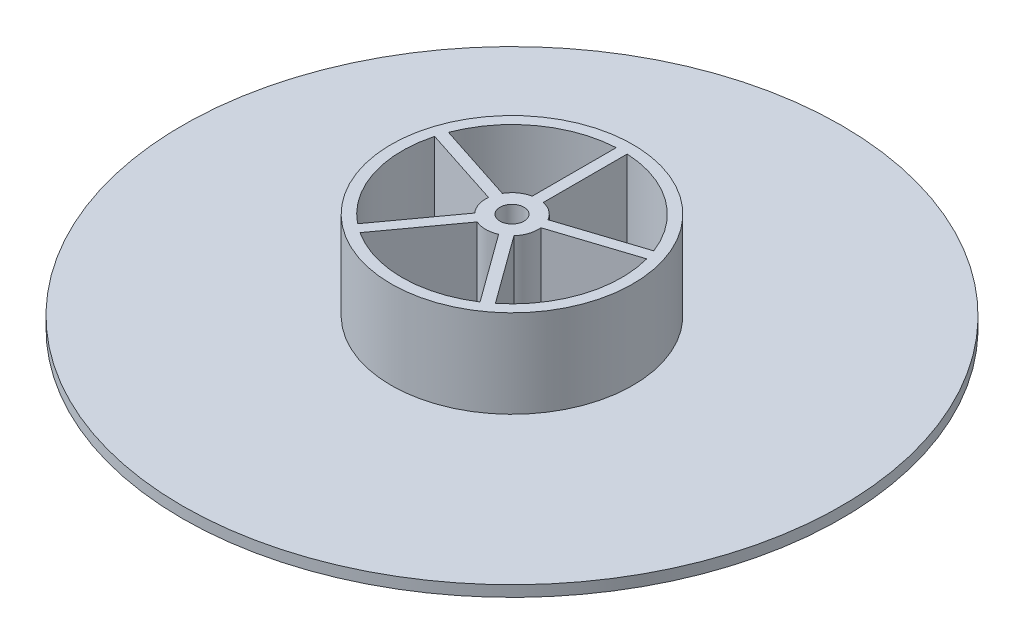
ISO-10303-21;
HEADER;
FILE_DESCRIPTION(('STEP AP214'),'2;1');
FILE_NAME('part.step','',(''),(''),'','','');
FILE_SCHEMA(('AUTOMOTIVE_DESIGN { 1 0 10303 214 1 1 1 1 }'));
ENDSEC;
DATA;
#1=APPLICATION_CONTEXT('core data for automotive mechanical design processes');
#2=APPLICATION_PROTOCOL_DEFINITION('international standard','automotive_design',2000,#1);
#3=PRODUCT_CONTEXT('',#1,'mechanical');
#4=PRODUCT('Part','Part','',(#3));
#5=PRODUCT_RELATED_PRODUCT_CATEGORY('part','',(#4));
#6=PRODUCT_DEFINITION_FORMATION('','',#4);
#7=PRODUCT_DEFINITION_CONTEXT('part definition',#1,'design');
#8=PRODUCT_DEFINITION('design','',#6,#7);
#9=PRODUCT_DEFINITION_SHAPE('','',#8);
#10=(LENGTH_UNIT() NAMED_UNIT(*) SI_UNIT(.MILLI.,.METRE.));
#11=(NAMED_UNIT(*) PLANE_ANGLE_UNIT() SI_UNIT($,.RADIAN.));
#12=(NAMED_UNIT(*) SI_UNIT($,.STERADIAN.) SOLID_ANGLE_UNIT());
#13=UNCERTAINTY_MEASURE_WITH_UNIT(LENGTH_MEASURE(1.E-05),#10,'distance_accuracy_value','');
#14=(GEOMETRIC_REPRESENTATION_CONTEXT(3) GLOBAL_UNCERTAINTY_ASSIGNED_CONTEXT((#13)) GLOBAL_UNIT_ASSIGNED_CONTEXT((#10,
#11,#12)) REPRESENTATION_CONTEXT('',''));
#15=CARTESIAN_POINT('',(0.,0.,0.));
#16=DIRECTION('',(0.,0.,1.));
#17=DIRECTION('',(1.,0.,0.));
#18=AXIS2_PLACEMENT_3D('',#15,#16,#17);
#19=CARTESIAN_POINT('',(0.,22.5,0.));
#20=DIRECTION('',(0.,-1.,0.));
#21=DIRECTION('',(0.,0.,-1.));
#22=AXIS2_PLACEMENT_3D('',#19,#20,#21);
#23=CYLINDRICAL_SURFACE('',#22,2.75);
#24=CARTESIAN_POINT('',(0.,22.5,0.));
#25=DIRECTION('',(0.,1.,0.));
#26=DIRECTION('',(0.,0.,1.));
#27=AXIS2_PLACEMENT_3D('',#24,#25,#26);
#28=CIRCLE('',#27,2.75);
#29=CARTESIAN_POINT('',(0.,22.5,2.75));
#30=VERTEX_POINT('',#29);
#31=EDGE_CURVE('E408',#30,#30,#28,.T.);
#32=ORIENTED_EDGE('',*,*,#31,.T.);
#33=EDGE_LOOP('',(#32));
#34=FACE_BOUND('',#33,.T.);
#35=CARTESIAN_POINT('',(0.,4.,0.));
#36=DIRECTION('',(0.,-1.,0.));
#37=DIRECTION('',(0.,0.,-1.));
#38=AXIS2_PLACEMENT_3D('',#35,#36,#37);
#39=CIRCLE('',#38,2.75);
#40=CARTESIAN_POINT('',(0.,4.,-2.75));
#41=VERTEX_POINT('',#40);
#42=EDGE_CURVE('E39',#41,#41,#39,.T.);
#43=ORIENTED_EDGE('',*,*,#42,.T.);
#44=EDGE_LOOP('',(#43));
#45=FACE_BOUND('',#44,.T.);
#46=ADVANCED_FACE('F35',(#34,#45),#23,.F.);
#47=CARTESIAN_POINT('',(0.,2.5,0.));
#48=DIRECTION('',(0.,1.,0.));
#49=DIRECTION('',(0.,0.,1.));
#50=AXIS2_PLACEMENT_3D('',#47,#48,#49);
#51=PLANE('',#50);
#52=CARTESIAN_POINT('',(0.,2.5,0.));
#53=DIRECTION('',(0.,1.,0.));
#54=DIRECTION('',(0.,0.,1.));
#55=AXIS2_PLACEMENT_3D('',#52,#53,#54);
#56=CIRCLE('',#55,75.);
#57=CARTESIAN_POINT('',(0.,2.5,75.));
#58=VERTEX_POINT('',#57);
#59=EDGE_CURVE('E426',#58,#58,#56,.T.);
#60=ORIENTED_EDGE('',*,*,#59,.T.);
#61=EDGE_LOOP('',(#60));
#62=FACE_BOUND('',#61,.T.);
#63=CARTESIAN_POINT('',(0.,2.5,0.));
#64=DIRECTION('',(0.,1.,0.));
#65=DIRECTION('',(0.,0.,1.));
#66=AXIS2_PLACEMENT_3D('',#63,#64,#65);
#67=CIRCLE('',#66,27.5);
#68=CARTESIAN_POINT('',(0.,2.5,27.5));
#69=VERTEX_POINT('',#68);
#70=EDGE_CURVE('E411',#69,#69,#67,.T.);
#71=ORIENTED_EDGE('',*,*,#70,.F.);
#72=EDGE_LOOP('',(#71));
#73=FACE_BOUND('',#72,.T.);
#74=ADVANCED_FACE('F443',(#62,#73),#51,.T.);
#75=CARTESIAN_POINT('',(0.,1.5,0.));
#76=DIRECTION('',(0.,-1.,0.));
#77=DIRECTION('',(0.,0.,-1.));
#78=AXIS2_PLACEMENT_3D('',#75,#76,#77);
#79=CYLINDRICAL_SURFACE('',#78,36.1243556529822);
#80=CARTESIAN_POINT('',(0.,1.5,0.));
#81=DIRECTION('',(0.,1.,0.));
#82=DIRECTION('',(0.,0.,1.));
#83=AXIS2_PLACEMENT_3D('',#80,#81,#82);
#84=CIRCLE('',#83,36.1243556529822);
#85=CARTESIAN_POINT('',(0.,1.5,36.1243556529822));
#86=VERTEX_POINT('',#85);
#87=EDGE_CURVE('E11',#86,#86,#84,.T.);
#88=ORIENTED_EDGE('',*,*,#87,.F.);
#89=EDGE_LOOP('',(#88));
#90=FACE_BOUND('',#89,.T.);
#91=CARTESIAN_POINT('',(0.,0.,0.));
#92=DIRECTION('',(0.,1.,0.));
#93=DIRECTION('',(0.,0.,1.));
#94=AXIS2_PLACEMENT_3D('',#91,#92,#93);
#95=CIRCLE('',#94,36.1243556529822);
#96=CARTESIAN_POINT('',(0.,0.,36.1243556529822));
#97=VERTEX_POINT('',#96);
#98=EDGE_CURVE('E44',#97,#97,#95,.T.);
#99=ORIENTED_EDGE('',*,*,#98,.T.);
#100=EDGE_LOOP('',(#99));
#101=FACE_BOUND('',#100,.T.);
#102=ADVANCED_FACE('F37',(#90,#101),#79,.T.);
#103=CARTESIAN_POINT('',(0.,0.,0.));
#104=DIRECTION('',(0.,1.,0.));
#105=DIRECTION('',(0.,0.,1.));
#106=AXIS2_PLACEMENT_3D('',#103,#104,#105);
#107=PLANE('',#106);
#108=DIRECTION('',(0.,0.,-1.));
#109=VECTOR('',#108,1.);
#110=CARTESIAN_POINT('',(-4.,0.,2.3094010767585));
#111=LINE('',#110,#109);
#112=CARTESIAN_POINT('',(-4.,0.,2.3094010767585));
#113=VERTEX_POINT('',#112);
#114=CARTESIAN_POINT('',(-4.,0.,-2.3094010767585));
#115=VERTEX_POINT('',#114);
#116=EDGE_CURVE('E245',#113,#115,#111,.T.);
#117=ORIENTED_EDGE('',*,*,#116,.F.);
#118=DIRECTION('',(-0.866025403784439,0.,-0.5));
#119=VECTOR('',#118,1.);
#120=CARTESIAN_POINT('',(0.,0.,4.61880215351701));
#121=LINE('',#120,#119);
#122=CARTESIAN_POINT('',(0.,0.,4.61880215351701));
#123=VERTEX_POINT('',#122);
#124=EDGE_CURVE('E52',#123,#113,#121,.T.);
#125=ORIENTED_EDGE('',*,*,#124,.F.);
#126=DIRECTION('',(-0.866025403784439,0.,0.5));
#127=VECTOR('',#126,1.);
#128=CARTESIAN_POINT('',(4.,0.,2.3094010767585));
#129=LINE('',#128,#127);
#130=CARTESIAN_POINT('',(4.,0.,2.3094010767585));
#131=VERTEX_POINT('',#130);
#132=EDGE_CURVE('E231',#131,#123,#129,.T.);
#133=ORIENTED_EDGE('',*,*,#132,.F.);
#134=DIRECTION('',(0.,0.,1.));
#135=VECTOR('',#134,1.);
#136=CARTESIAN_POINT('',(4.,0.,-2.3094010767585));
#137=LINE('',#136,#135);
#138=CARTESIAN_POINT('',(4.,0.,-2.3094010767585));
#139=VERTEX_POINT('',#138);
#140=EDGE_CURVE('E234',#139,#131,#137,.T.);
#141=ORIENTED_EDGE('',*,*,#140,.F.);
#142=DIRECTION('',(0.866025403784439,0.,0.5));
#143=VECTOR('',#142,1.);
#144=CARTESIAN_POINT('',(0.,0.,-4.61880215351701));
#145=LINE('',#144,#143);
#146=CARTESIAN_POINT('',(0.,0.,-4.61880215351701));
#147=VERTEX_POINT('',#146);
#148=EDGE_CURVE('E250',#147,#139,#145,.T.);
#149=ORIENTED_EDGE('',*,*,#148,.F.);
#150=DIRECTION('',(0.866025403784439,0.,-0.5));
#151=VECTOR('',#150,1.);
#152=CARTESIAN_POINT('',(-4.,0.,-2.3094010767585));
#153=LINE('',#152,#151);
#154=EDGE_CURVE('E247',#115,#147,#153,.T.);
#155=ORIENTED_EDGE('',*,*,#154,.F.);
#156=EDGE_LOOP('',(#117,#125,#133,#141,#149,#155));
#157=FACE_BOUND('',#156,.T.);
#158=ORIENTED_EDGE('',*,*,#98,.F.);
#159=EDGE_LOOP('',(#158));
#160=FACE_BOUND('',#159,.T.);
#161=ADVANCED_FACE('F432',(#157,#160),#107,.F.);
#162=CARTESIAN_POINT('',(0.,1.5,0.));
#163=DIRECTION('',(0.,1.,0.));
#164=DIRECTION('',(0.,0.,1.));
#165=AXIS2_PLACEMENT_3D('',#162,#163,#164);
#166=PLANE('',#165);
#167=CARTESIAN_POINT('',(0.,1.5,0.));
#168=DIRECTION('',(0.,1.,0.));
#169=DIRECTION('',(0.,0.,1.));
#170=AXIS2_PLACEMENT_3D('',#167,#168,#169);
#171=CIRCLE('',#170,43.1243556529822);
#172=CARTESIAN_POINT('',(0.,1.5,43.1243556529822));
#173=VERTEX_POINT('',#172);
#174=EDGE_CURVE('E418',#173,#173,#171,.T.);
#175=ORIENTED_EDGE('',*,*,#174,.F.);
#176=EDGE_LOOP('',(#175));
#177=FACE_BOUND('',#176,.T.);
#178=ORIENTED_EDGE('',*,*,#87,.T.);
#179=EDGE_LOOP('',(#178));
#180=FACE_BOUND('',#179,.T.);
#181=ADVANCED_FACE('F434',(#177,#180),#166,.F.);
#182=CARTESIAN_POINT('',(0.,0.,0.));
#183=DIRECTION('',(0.,1.,0.));
#184=DIRECTION('',(0.,0.,1.));
#185=AXIS2_PLACEMENT_3D('',#182,#183,#184);
#186=PLANE('',#185);
#187=CARTESIAN_POINT('',(0.,0.,0.));
#188=DIRECTION('',(0.,1.,0.));
#189=DIRECTION('',(0.,0.,1.));
#190=AXIS2_PLACEMENT_3D('',#187,#188,#189);
#191=CIRCLE('',#190,75.);
#192=CARTESIAN_POINT('',(0.,0.,75.));
#193=VERTEX_POINT('',#192);
#194=EDGE_CURVE('E421',#193,#193,#191,.T.);
#195=ORIENTED_EDGE('',*,*,#194,.F.);
#196=EDGE_LOOP('',(#195));
#197=FACE_BOUND('',#196,.T.);
#198=CARTESIAN_POINT('',(0.,0.,0.));
#199=DIRECTION('',(0.,1.,0.));
#200=DIRECTION('',(0.,0.,1.));
#201=AXIS2_PLACEMENT_3D('',#198,#199,#200);
#202=CIRCLE('',#201,43.1243556529822);
#203=CARTESIAN_POINT('',(0.,0.,43.1243556529822));
#204=VERTEX_POINT('',#203);
#205=EDGE_CURVE('E415',#204,#204,#202,.T.);
#206=ORIENTED_EDGE('',*,*,#205,.T.);
#207=EDGE_LOOP('',(#206));
#208=FACE_BOUND('',#207,.T.);
#209=ADVANCED_FACE('F440',(#197,#208),#186,.F.);
#210=CARTESIAN_POINT('',(0.,1.5,0.));
#211=DIRECTION('',(0.,-1.,0.));
#212=DIRECTION('',(0.,0.,-1.));
#213=AXIS2_PLACEMENT_3D('',#210,#211,#212);
#214=CYLINDRICAL_SURFACE('',#213,43.1243556529822);
#215=ORIENTED_EDGE('',*,*,#174,.T.);
#216=EDGE_LOOP('',(#215));
#217=FACE_BOUND('',#216,.T.);
#218=ORIENTED_EDGE('',*,*,#205,.F.);
#219=EDGE_LOOP('',(#218));
#220=FACE_BOUND('',#219,.T.);
#221=ADVANCED_FACE('F470',(#217,#220),#214,.F.);
#222=CARTESIAN_POINT('',(0.,2.5,0.));
#223=DIRECTION('',(0.,-1.,0.));
#224=DIRECTION('',(0.,0.,-1.));
#225=AXIS2_PLACEMENT_3D('',#222,#223,#224);
#226=CYLINDRICAL_SURFACE('',#225,75.);
#227=ORIENTED_EDGE('',*,*,#59,.F.);
#228=EDGE_LOOP('',(#227));
#229=FACE_BOUND('',#228,.T.);
#230=ORIENTED_EDGE('',*,*,#194,.T.);
#231=EDGE_LOOP('',(#230));
#232=FACE_BOUND('',#231,.T.);
#233=ADVANCED_FACE('F465',(#229,#232),#226,.T.);
#234=CARTESIAN_POINT('',(0.,22.5,0.));
#235=DIRECTION('',(0.,1.,0.));
#236=DIRECTION('',(0.,0.,1.));
#237=AXIS2_PLACEMENT_3D('',#234,#235,#236);
#238=PLANE('',#237);
#239=DIRECTION('',(-0.587785252292483,0.,0.809016994374941));
#240=VECTOR('',#239,1.);
#241=CARTESIAN_POINT('',(-2.4380567536281,22.5,5.48232425765646));
#242=LINE('',#241,#240);
#243=CARTESIAN_POINT('',(-2.4380567536281,22.5,5.48232425765646));
#244=VERTEX_POINT('',#243);
#245=CARTESIAN_POINT('',(-13.6649802806558,22.5,20.9348588227695));
#246=VERTEX_POINT('',#245);
#247=EDGE_CURVE('E296',#244,#246,#242,.T.);
#248=ORIENTED_EDGE('',*,*,#247,.F.);
#249=CARTESIAN_POINT('',(0.,22.5,0.));
#250=DIRECTION('',(0.,-1.,0.));
#251=DIRECTION('',(0.,0.,1.));
#252=AXIS2_PLACEMENT_3D('',#249,#250,#251);
#253=CIRCLE('',#252,6.);
#254=CARTESIAN_POINT('',(2.4380567536281,22.5,5.48232425765646));
#255=VERTEX_POINT('',#254);
#256=EDGE_CURVE('E294',#255,#244,#253,.T.);
#257=ORIENTED_EDGE('',*,*,#256,.F.);
#258=DIRECTION('',(-0.587785252292467,0.,-0.809016994374952));
#259=VECTOR('',#258,1.);
#260=CARTESIAN_POINT('',(2.4380567536281,22.5,5.48232425765646));
#261=LINE('',#260,#259);
#262=CARTESIAN_POINT('',(13.6649802806555,22.5,20.9348588227697));
#263=VERTEX_POINT('',#262);
#264=EDGE_CURVE('E302',#263,#255,#261,.T.);
#265=ORIENTED_EDGE('',*,*,#264,.F.);
#266=CARTESIAN_POINT('',(0.,22.5,0.));
#267=DIRECTION('',(0.,1.,0.));
#268=DIRECTION('',(0.,0.,1.));
#269=AXIS2_PLACEMENT_3D('',#266,#267,#268);
#270=CIRCLE('',#269,25.);
#271=EDGE_CURVE('E299',#246,#263,#270,.T.);
#272=ORIENTED_EDGE('',*,*,#271,.F.);
#273=EDGE_LOOP('',(#248,#257,#265,#272));
#274=FACE_BOUND('',#273,.T.);
#275=DIRECTION('',(0.951056516295155,0.,-0.309016994374944));
#276=VECTOR('',#275,1.);
#277=CARTESIAN_POINT('',(5.19485869387149,22.5,-3.00223968908343));
#278=LINE('',#277,#276);
#279=CARTESIAN_POINT('',(5.19485869387149,22.5,-3.00223968908343));
#280=VERTEX_POINT('',#279);
#281=CARTESIAN_POINT('',(23.3604025496979,22.5,-8.904582680624));
#282=VERTEX_POINT('',#281);
#283=EDGE_CURVE('E354',#280,#282,#278,.T.);
#284=ORIENTED_EDGE('',*,*,#283,.F.);
#285=CARTESIAN_POINT('',(0.,22.5,0.));
#286=DIRECTION('',(0.,-1.,0.));
#287=DIRECTION('',(0.,0.,1.));
#288=AXIS2_PLACEMENT_3D('',#285,#286,#287);
#289=CIRCLE('',#288,6.);
#290=CARTESIAN_POINT('',(1.25,22.5,-5.86834729715275));
#291=VERTEX_POINT('',#290);
#292=EDGE_CURVE('E352',#291,#280,#289,.T.);
#293=ORIENTED_EDGE('',*,*,#292,.F.);
#294=DIRECTION('',(0.,0.,1.));
#295=VECTOR('',#294,1.);
#296=CARTESIAN_POINT('',(1.25,22.5,-5.86834729715275));
#297=LINE('',#296,#295);
#298=CARTESIAN_POINT('',(1.25,22.5,-24.9687304442977));
#299=VERTEX_POINT('',#298);
#300=EDGE_CURVE('E360',#299,#291,#297,.T.);
#301=ORIENTED_EDGE('',*,*,#300,.F.);
#302=CARTESIAN_POINT('',(0.,22.5,0.));
#303=DIRECTION('',(0.,1.,0.));
#304=DIRECTION('',(0.,0.,1.));
#305=AXIS2_PLACEMENT_3D('',#302,#303,#304);
#306=CIRCLE('',#305,25.);
#307=EDGE_CURVE('E357',#282,#299,#306,.T.);
#308=ORIENTED_EDGE('',*,*,#307,.F.);
#309=EDGE_LOOP('',(#284,#293,#301,#308));
#310=FACE_BOUND('',#309,.T.);
#311=ORIENTED_EDGE('',*,*,#31,.F.);
#312=EDGE_LOOP('',(#311));
#313=FACE_BOUND('',#312,.T.);
#314=CARTESIAN_POINT('',(0.,22.5,0.));
#315=DIRECTION('',(0.,1.,0.));
#316=DIRECTION('',(0.,0.,1.));
#317=AXIS2_PLACEMENT_3D('',#314,#315,#316);
#318=CIRCLE('',#317,27.5);
#319=CARTESIAN_POINT('',(0.,22.5,27.5));
#320=VERTEX_POINT('',#319);
#321=EDGE_CURVE('E412',#320,#320,#318,.T.);
#322=ORIENTED_EDGE('',*,*,#321,.T.);
#323=EDGE_LOOP('',(#322));
#324=FACE_BOUND('',#323,.T.);
#325=DIRECTION('',(0.,0.,-1.));
#326=VECTOR('',#325,1.);
#327=CARTESIAN_POINT('',(-1.25,22.5,-5.86834729715275));
#328=LINE('',#327,#326);
#329=CARTESIAN_POINT('',(-1.25,22.5,-5.86834729715275));
#330=VERTEX_POINT('',#329);
#331=CARTESIAN_POINT('',(-1.25,22.5,-24.9687304442977));
#332=VERTEX_POINT('',#331);
#333=EDGE_CURVE('E382',#330,#332,#328,.T.);
#334=ORIENTED_EDGE('',*,*,#333,.F.);
#335=CARTESIAN_POINT('',(0.,22.5,0.));
#336=DIRECTION('',(0.,-1.,0.));
#337=DIRECTION('',(0.,0.,1.));
#338=AXIS2_PLACEMENT_3D('',#335,#336,#337);
#339=CIRCLE('',#338,6.);
#340=CARTESIAN_POINT('',(-5.19485869387149,22.5,-3.00223968908343));
#341=VERTEX_POINT('',#340);
#342=EDGE_CURVE('E380',#341,#330,#339,.T.);
#343=ORIENTED_EDGE('',*,*,#342,.F.);
#344=DIRECTION('',(0.951056516295149,0.,0.309016994374962));
#345=VECTOR('',#344,1.);
#346=CARTESIAN_POINT('',(-5.19485869387149,22.5,-3.00223968908343));
#347=LINE('',#346,#345);
#348=CARTESIAN_POINT('',(-23.3604025496977,22.5,-8.90458268062433));
#349=VERTEX_POINT('',#348);
#350=EDGE_CURVE('E388',#349,#341,#347,.T.);
#351=ORIENTED_EDGE('',*,*,#350,.F.);
#352=CARTESIAN_POINT('',(0.,22.5,0.));
#353=DIRECTION('',(0.,1.,0.));
#354=DIRECTION('',(0.,0.,1.));
#355=AXIS2_PLACEMENT_3D('',#352,#353,#354);
#356=CIRCLE('',#355,25.);
#357=EDGE_CURVE('E385',#332,#349,#356,.T.);
#358=ORIENTED_EDGE('',*,*,#357,.F.);
#359=EDGE_LOOP('',(#334,#343,#351,#358));
#360=FACE_BOUND('',#359,.T.);
#361=DIRECTION('',(0.587785252292467,0.,0.809016994374952));
#362=VECTOR('',#361,1.);
#363=CARTESIAN_POINT('',(4.46059923956547,22.5,4.01286112692527));
#364=LINE('',#363,#362);
#365=CARTESIAN_POINT('',(4.46059923956547,22.5,4.01286112692527));
#366=VERTEX_POINT('',#365);
#367=CARTESIAN_POINT('',(15.6875227665929,22.5,19.4653956920385));
#368=VERTEX_POINT('',#367);
#369=EDGE_CURVE('E325',#366,#368,#364,.T.);
#370=ORIENTED_EDGE('',*,*,#369,.F.);
#371=CARTESIAN_POINT('',(0.,22.5,0.));
#372=DIRECTION('',(0.,-1.,0.));
#373=DIRECTION('',(0.,0.,1.));
#374=AXIS2_PLACEMENT_3D('',#371,#372,#373);
#375=CIRCLE('',#374,6.);
#376=CARTESIAN_POINT('',(5.96740117980886,22.5,-0.624598398345548));
#377=VERTEX_POINT('',#376);
#378=EDGE_CURVE('E323',#377,#366,#375,.T.);
#379=ORIENTED_EDGE('',*,*,#378,.F.);
#380=DIRECTION('',(-0.951056516295155,0.,0.309016994374944));
#381=VECTOR('',#380,1.);
#382=CARTESIAN_POINT('',(5.96740117980886,22.5,-0.624598398345548));
#383=LINE('',#382,#381);
#384=CARTESIAN_POINT('',(24.1329450356352,22.5,-6.52694138988612));
#385=VERTEX_POINT('',#384);
#386=EDGE_CURVE('E331',#385,#377,#383,.T.);
#387=ORIENTED_EDGE('',*,*,#386,.F.);
#388=CARTESIAN_POINT('',(0.,22.5,0.));
#389=DIRECTION('',(0.,1.,0.));
#390=DIRECTION('',(0.,0.,1.));
#391=AXIS2_PLACEMENT_3D('',#388,#389,#390);
#392=CIRCLE('',#391,25.);
#393=EDGE_CURVE('E328',#368,#385,#392,.T.);
#394=ORIENTED_EDGE('',*,*,#393,.F.);
#395=EDGE_LOOP('',(#370,#379,#387,#394));
#396=FACE_BOUND('',#395,.T.);
#397=DIRECTION('',(-0.951056516295149,0.,-0.309016994374962));
#398=VECTOR('',#397,1.);
#399=CARTESIAN_POINT('',(-5.96740117980886,22.5,-0.624598398345547));
#400=LINE('',#399,#398);
#401=CARTESIAN_POINT('',(-5.96740117980886,22.5,-0.624598398345547));
#402=VERTEX_POINT('',#401);
#403=CARTESIAN_POINT('',(-24.1329450356351,22.5,-6.52694138988646));
#404=VERTEX_POINT('',#403);
#405=EDGE_CURVE('E266',#402,#404,#400,.T.);
#406=ORIENTED_EDGE('',*,*,#405,.F.);
#407=CARTESIAN_POINT('',(0.,22.5,0.));
#408=DIRECTION('',(0.,-1.,0.));
#409=DIRECTION('',(0.,0.,1.));
#410=AXIS2_PLACEMENT_3D('',#407,#408,#409);
#411=CIRCLE('',#410,6.);
#412=CARTESIAN_POINT('',(-4.46059923956547,22.5,4.01286112692527));
#413=VERTEX_POINT('',#412);
#414=EDGE_CURVE('E264',#413,#402,#411,.T.);
#415=ORIENTED_EDGE('',*,*,#414,.F.);
#416=DIRECTION('',(0.587785252292482,0.,-0.809016994374941));
#417=VECTOR('',#416,1.);
#418=CARTESIAN_POINT('',(-4.46059923956547,22.5,4.01286112692527));
#419=LINE('',#418,#417);
#420=CARTESIAN_POINT('',(-15.6875227665931,22.5,19.4653956920383));
#421=VERTEX_POINT('',#420);
#422=EDGE_CURVE('E272',#421,#413,#419,.T.);
#423=ORIENTED_EDGE('',*,*,#422,.F.);
#424=CARTESIAN_POINT('',(0.,22.5,0.));
#425=DIRECTION('',(0.,1.,0.));
#426=DIRECTION('',(0.,0.,1.));
#427=AXIS2_PLACEMENT_3D('',#424,#425,#426);
#428=CIRCLE('',#427,25.);
#429=EDGE_CURVE('E269',#404,#421,#428,.T.);
#430=ORIENTED_EDGE('',*,*,#429,.F.);
#431=EDGE_LOOP('',(#406,#415,#423,#430));
#432=FACE_BOUND('',#431,.T.);
#433=ADVANCED_FACE('F461',(#274,#310,#313,#324,#360,#396,#432),#238,.T.);
#434=CARTESIAN_POINT('',(0.,22.5,0.));
#435=DIRECTION('',(0.,-1.,0.));
#436=DIRECTION('',(0.,0.,-1.));
#437=AXIS2_PLACEMENT_3D('',#434,#435,#436);
#438=CYLINDRICAL_SURFACE('',#437,27.5);
#439=ORIENTED_EDGE('',*,*,#321,.F.);
#440=EDGE_LOOP('',(#439));
#441=FACE_BOUND('',#440,.T.);
#442=ORIENTED_EDGE('',*,*,#70,.T.);
#443=EDGE_LOOP('',(#442));
#444=FACE_BOUND('',#443,.T.);
#445=ADVANCED_FACE('F464',(#441,#444),#438,.T.);
#446=CARTESIAN_POINT('',(0.,22.5,0.));
#447=DIRECTION('',(0.,-1.,0.));
#448=DIRECTION('',(0.,0.,-1.));
#449=AXIS2_PLACEMENT_3D('',#446,#447,#448);
#450=CYLINDRICAL_SURFACE('',#449,6.);
#451=CARTESIAN_POINT('',(0.,2.5,0.));
#452=DIRECTION('',(0.,-1.,0.));
#453=DIRECTION('',(0.,0.,1.));
#454=AXIS2_PLACEMENT_3D('',#451,#452,#453);
#455=CIRCLE('',#454,6.);
#456=CARTESIAN_POINT('',(-5.19485869387149,2.5,-3.00223968908343));
#457=VERTEX_POINT('',#456);
#458=CARTESIAN_POINT('',(-1.25,2.5,-5.86834729715275));
#459=VERTEX_POINT('',#458);
#460=EDGE_CURVE('E60',#457,#459,#455,.T.);
#461=ORIENTED_EDGE('',*,*,#460,.F.);
#462=DIRECTION('',(0.,-1.,0.));
#463=VECTOR('',#462,1.);
#464=CARTESIAN_POINT('',(-5.19485869387149,22.5,-3.00223968908343));
#465=LINE('',#464,#463);
#466=EDGE_CURVE('E390',#341,#457,#465,.T.);
#467=ORIENTED_EDGE('',*,*,#466,.F.);
#468=ORIENTED_EDGE('',*,*,#342,.T.);
#469=DIRECTION('',(0.,-1.,0.));
#470=VECTOR('',#469,1.);
#471=CARTESIAN_POINT('',(-1.25,22.5,-5.86834729715275));
#472=LINE('',#471,#470);
#473=EDGE_CURVE('E405',#330,#459,#472,.T.);
#474=ORIENTED_EDGE('',*,*,#473,.T.);
#475=EDGE_LOOP('',(#461,#467,#468,#474));
#476=FACE_BOUND('',#475,.T.);
#477=ADVANCED_FACE('F459',(#476),#450,.T.);
#478=CARTESIAN_POINT('',(-1.25,22.5,-5.86834729715275));
#479=DIRECTION('',(-1.,0.,0.));
#480=DIRECTION('',(0.,0.,1.));
#481=AXIS2_PLACEMENT_3D('',#478,#479,#480);
#482=PLANE('',#481);
#483=DIRECTION('',(0.,0.,-1.));
#484=VECTOR('',#483,1.);
#485=CARTESIAN_POINT('',(-1.25,2.5,-5.86834729715275));
#486=LINE('',#485,#484);
#487=CARTESIAN_POINT('',(-1.25,2.5,-24.9687304442977));
#488=VERTEX_POINT('',#487);
#489=EDGE_CURVE('E392',#459,#488,#486,.T.);
#490=ORIENTED_EDGE('',*,*,#489,.F.);
#491=ORIENTED_EDGE('',*,*,#473,.F.);
#492=ORIENTED_EDGE('',*,*,#333,.T.);
#493=DIRECTION('',(0.,-1.,0.));
#494=VECTOR('',#493,1.);
#495=CARTESIAN_POINT('',(-1.25,22.5,-24.9687304442977));
#496=LINE('',#495,#494);
#497=EDGE_CURVE('E402',#332,#488,#496,.T.);
#498=ORIENTED_EDGE('',*,*,#497,.T.);
#499=EDGE_LOOP('',(#490,#491,#492,#498));
#500=FACE_BOUND('',#499,.T.);
#501=ADVANCED_FACE('F510',(#500),#482,.T.);
#502=CARTESIAN_POINT('',(0.,22.5,0.));
#503=DIRECTION('',(0.,-1.,0.));
#504=DIRECTION('',(0.,0.,-1.));
#505=AXIS2_PLACEMENT_3D('',#502,#503,#504);
#506=CYLINDRICAL_SURFACE('',#505,25.);
#507=CARTESIAN_POINT('',(0.,2.5,0.));
#508=DIRECTION('',(0.,1.,0.));
#509=DIRECTION('',(0.,0.,1.));
#510=AXIS2_PLACEMENT_3D('',#507,#508,#509);
#511=CIRCLE('',#510,25.);
#512=CARTESIAN_POINT('',(-23.3604025496977,2.5,-8.90458268062435));
#513=VERTEX_POINT('',#512);
#514=EDGE_CURVE('E394',#488,#513,#511,.T.);
#515=ORIENTED_EDGE('',*,*,#514,.F.);
#516=ORIENTED_EDGE('',*,*,#497,.F.);
#517=ORIENTED_EDGE('',*,*,#357,.T.);
#518=DIRECTION('',(0.,-1.,0.));
#519=VECTOR('',#518,1.);
#520=CARTESIAN_POINT('',(-23.3604025496977,22.5,-8.90458268062435));
#521=LINE('',#520,#519);
#522=EDGE_CURVE('E399',#349,#513,#521,.T.);
#523=ORIENTED_EDGE('',*,*,#522,.T.);
#524=EDGE_LOOP('',(#515,#516,#517,#523));
#525=FACE_BOUND('',#524,.T.);
#526=ADVANCED_FACE('F517',(#525),#506,.F.);
#527=CARTESIAN_POINT('',(-5.19485869387149,22.5,-3.00223968908343));
#528=DIRECTION('',(0.309016994374962,0.,-0.951056516295149));
#529=DIRECTION('',(-0.951056516295149,0.,-0.309016994374962));
#530=AXIS2_PLACEMENT_3D('',#527,#528,#529);
#531=PLANE('',#530);
#532=DIRECTION('',(0.951056516295149,0.,0.309016994374962));
#533=VECTOR('',#532,1.);
#534=CARTESIAN_POINT('',(-5.19485869387149,2.5,-3.00223968908343));
#535=LINE('',#534,#533);
#536=EDGE_CURVE('E383',#513,#457,#535,.T.);
#537=ORIENTED_EDGE('',*,*,#536,.F.);
#538=ORIENTED_EDGE('',*,*,#522,.F.);
#539=ORIENTED_EDGE('',*,*,#350,.T.);
#540=ORIENTED_EDGE('',*,*,#466,.T.);
#541=EDGE_LOOP('',(#537,#538,#539,#540));
#542=FACE_BOUND('',#541,.T.);
#543=ADVANCED_FACE('F524',(#542),#531,.T.);
#544=CARTESIAN_POINT('',(0.,22.5,0.));
#545=DIRECTION('',(0.,-1.,0.));
#546=DIRECTION('',(0.,0.,-1.));
#547=AXIS2_PLACEMENT_3D('',#544,#545,#546);
#548=CYLINDRICAL_SURFACE('',#547,6.);
#549=CARTESIAN_POINT('',(0.,2.5,0.));
#550=DIRECTION('',(0.,-1.,0.));
#551=DIRECTION('',(0.,0.,1.));
#552=AXIS2_PLACEMENT_3D('',#549,#550,#551);
#553=CIRCLE('',#552,6.);
#554=CARTESIAN_POINT('',(1.25,2.5,-5.86834729715275));
#555=VERTEX_POINT('',#554);
#556=CARTESIAN_POINT('',(5.19485869387149,2.5,-3.00223968908343));
#557=VERTEX_POINT('',#556);
#558=EDGE_CURVE('E351',#555,#557,#553,.T.);
#559=ORIENTED_EDGE('',*,*,#558,.F.);
#560=DIRECTION('',(0.,-1.,0.));
#561=VECTOR('',#560,1.);
#562=CARTESIAN_POINT('',(1.25,22.5,-5.86834729715275));
#563=LINE('',#562,#561);
#564=EDGE_CURVE('E362',#291,#555,#563,.T.);
#565=ORIENTED_EDGE('',*,*,#564,.F.);
#566=ORIENTED_EDGE('',*,*,#292,.T.);
#567=DIRECTION('',(0.,-1.,0.));
#568=VECTOR('',#567,1.);
#569=CARTESIAN_POINT('',(5.19485869387149,22.5,-3.00223968908343));
#570=LINE('',#569,#568);
#571=EDGE_CURVE('E377',#280,#557,#570,.T.);
#572=ORIENTED_EDGE('',*,*,#571,.T.);
#573=EDGE_LOOP('',(#559,#565,#566,#572));
#574=FACE_BOUND('',#573,.T.);
#575=ADVANCED_FACE('F532',(#574),#548,.T.);
#576=CARTESIAN_POINT('',(5.19485869387149,22.5,-3.00223968908343));
#577=DIRECTION('',(-0.309016994374944,0.,-0.951056516295155));
#578=DIRECTION('',(-0.951056516295155,0.,0.309016994374944));
#579=AXIS2_PLACEMENT_3D('',#576,#577,#578);
#580=PLANE('',#579);
#581=DIRECTION('',(0.951056516295155,0.,-0.309016994374944));
#582=VECTOR('',#581,1.);
#583=CARTESIAN_POINT('',(5.19485869387149,2.5,-3.00223968908343));
#584=LINE('',#583,#582);
#585=CARTESIAN_POINT('',(23.3604025496979,2.5,-8.904582680624));
#586=VERTEX_POINT('',#585);
#587=EDGE_CURVE('E364',#557,#586,#584,.T.);
#588=ORIENTED_EDGE('',*,*,#587,.F.);
#589=ORIENTED_EDGE('',*,*,#571,.F.);
#590=ORIENTED_EDGE('',*,*,#283,.T.);
#591=DIRECTION('',(0.,-1.,0.));
#592=VECTOR('',#591,1.);
#593=CARTESIAN_POINT('',(23.3604025496979,22.5,-8.904582680624));
#594=LINE('',#593,#592);
#595=EDGE_CURVE('E374',#282,#586,#594,.T.);
#596=ORIENTED_EDGE('',*,*,#595,.T.);
#597=EDGE_LOOP('',(#588,#589,#590,#596));
#598=FACE_BOUND('',#597,.T.);
#599=ADVANCED_FACE('F540',(#598),#580,.T.);
#600=CARTESIAN_POINT('',(0.,22.5,0.));
#601=DIRECTION('',(0.,-1.,0.));
#602=DIRECTION('',(0.,0.,-1.));
#603=AXIS2_PLACEMENT_3D('',#600,#601,#602);
#604=CYLINDRICAL_SURFACE('',#603,25.);
#605=CARTESIAN_POINT('',(0.,2.5,0.));
#606=DIRECTION('',(0.,1.,0.));
#607=DIRECTION('',(0.,0.,1.));
#608=AXIS2_PLACEMENT_3D('',#605,#606,#607);
#609=CIRCLE('',#608,25.);
#610=CARTESIAN_POINT('',(1.25,2.5,-24.9687304442977));
#611=VERTEX_POINT('',#610);
#612=EDGE_CURVE('E366',#586,#611,#609,.T.);
#613=ORIENTED_EDGE('',*,*,#612,.F.);
#614=ORIENTED_EDGE('',*,*,#595,.F.);
#615=ORIENTED_EDGE('',*,*,#307,.T.);
#616=DIRECTION('',(0.,-1.,0.));
#617=VECTOR('',#616,1.);
#618=CARTESIAN_POINT('',(1.25,22.5,-24.9687304442977));
#619=LINE('',#618,#617);
#620=EDGE_CURVE('E371',#299,#611,#619,.T.);
#621=ORIENTED_EDGE('',*,*,#620,.T.);
#622=EDGE_LOOP('',(#613,#614,#615,#621));
#623=FACE_BOUND('',#622,.T.);
#624=ADVANCED_FACE('F548',(#623),#604,.F.);
#625=CARTESIAN_POINT('',(1.25,22.5,-5.86834729715275));
#626=DIRECTION('',(1.,0.,0.));
#627=DIRECTION('',(0.,0.,-1.));
#628=AXIS2_PLACEMENT_3D('',#625,#626,#627);
#629=PLANE('',#628);
#630=DIRECTION('',(0.,0.,1.));
#631=VECTOR('',#630,1.);
#632=CARTESIAN_POINT('',(1.25,2.5,-5.86834729715275));
#633=LINE('',#632,#631);
#634=EDGE_CURVE('E355',#611,#555,#633,.T.);
#635=ORIENTED_EDGE('',*,*,#634,.F.);
#636=ORIENTED_EDGE('',*,*,#620,.F.);
#637=ORIENTED_EDGE('',*,*,#300,.T.);
#638=ORIENTED_EDGE('',*,*,#564,.T.);
#639=EDGE_LOOP('',(#635,#636,#637,#638));
#640=FACE_BOUND('',#639,.T.);
#641=ADVANCED_FACE('F556',(#640),#629,.T.);
#642=CARTESIAN_POINT('',(0.,22.5,0.));
#643=DIRECTION('',(0.,-1.,0.));
#644=DIRECTION('',(0.,0.,-1.));
#645=AXIS2_PLACEMENT_3D('',#642,#643,#644);
#646=CYLINDRICAL_SURFACE('',#645,6.);
#647=CARTESIAN_POINT('',(0.,2.5,0.));
#648=DIRECTION('',(0.,-1.,0.));
#649=DIRECTION('',(0.,0.,1.));
#650=AXIS2_PLACEMENT_3D('',#647,#648,#649);
#651=CIRCLE('',#650,6.);
#652=CARTESIAN_POINT('',(5.96740117980886,2.5,-0.624598398345548));
#653=VERTEX_POINT('',#652);
#654=CARTESIAN_POINT('',(4.46059923956547,2.5,4.01286112692527));
#655=VERTEX_POINT('',#654);
#656=EDGE_CURVE('E322',#653,#655,#651,.T.);
#657=ORIENTED_EDGE('',*,*,#656,.F.);
#658=DIRECTION('',(0.,-1.,0.));
#659=VECTOR('',#658,1.);
#660=CARTESIAN_POINT('',(5.96740117980886,22.5,-0.624598398345548));
#661=LINE('',#660,#659);
#662=EDGE_CURVE('E333',#377,#653,#661,.T.);
#663=ORIENTED_EDGE('',*,*,#662,.F.);
#664=ORIENTED_EDGE('',*,*,#378,.T.);
#665=DIRECTION('',(0.,-1.,0.));
#666=VECTOR('',#665,1.);
#667=CARTESIAN_POINT('',(4.46059923956547,22.5,4.01286112692527));
#668=LINE('',#667,#666);
#669=EDGE_CURVE('E348',#366,#655,#668,.T.);
#670=ORIENTED_EDGE('',*,*,#669,.T.);
#671=EDGE_LOOP('',(#657,#663,#664,#670));
#672=FACE_BOUND('',#671,.T.);
#673=ADVANCED_FACE('F564',(#672),#646,.T.);
#674=CARTESIAN_POINT('',(4.46059923956547,22.5,4.01286112692527));
#675=DIRECTION('',(0.809016994374952,0.,-0.587785252292467));
#676=DIRECTION('',(-0.587785252292467,0.,-0.809016994374952));
#677=AXIS2_PLACEMENT_3D('',#674,#675,#676);
#678=PLANE('',#677);
#679=DIRECTION('',(0.587785252292467,0.,0.809016994374952));
#680=VECTOR('',#679,1.);
#681=CARTESIAN_POINT('',(4.46059923956547,2.5,4.01286112692527));
#682=LINE('',#681,#680);
#683=CARTESIAN_POINT('',(15.6875227665929,2.5,19.4653956920385));
#684=VERTEX_POINT('',#683);
#685=EDGE_CURVE('E335',#655,#684,#682,.T.);
#686=ORIENTED_EDGE('',*,*,#685,.F.);
#687=ORIENTED_EDGE('',*,*,#669,.F.);
#688=ORIENTED_EDGE('',*,*,#369,.T.);
#689=DIRECTION('',(0.,-1.,0.));
#690=VECTOR('',#689,1.);
#691=CARTESIAN_POINT('',(15.6875227665929,22.5,19.4653956920385));
#692=LINE('',#691,#690);
#693=EDGE_CURVE('E345',#368,#684,#692,.T.);
#694=ORIENTED_EDGE('',*,*,#693,.T.);
#695=EDGE_LOOP('',(#686,#687,#688,#694));
#696=FACE_BOUND('',#695,.T.);
#697=ADVANCED_FACE('F572',(#696),#678,.T.);
#698=CARTESIAN_POINT('',(0.,22.5,0.));
#699=DIRECTION('',(0.,-1.,0.));
#700=DIRECTION('',(0.,0.,-1.));
#701=AXIS2_PLACEMENT_3D('',#698,#699,#700);
#702=CYLINDRICAL_SURFACE('',#701,25.);
#703=CARTESIAN_POINT('',(0.,2.5,0.));
#704=DIRECTION('',(0.,1.,0.));
#705=DIRECTION('',(0.,0.,1.));
#706=AXIS2_PLACEMENT_3D('',#703,#704,#705);
#707=CIRCLE('',#706,25.);
#708=CARTESIAN_POINT('',(24.1329450356352,2.5,-6.52694138988612));
#709=VERTEX_POINT('',#708);
#710=EDGE_CURVE('E337',#684,#709,#707,.T.);
#711=ORIENTED_EDGE('',*,*,#710,.F.);
#712=ORIENTED_EDGE('',*,*,#693,.F.);
#713=ORIENTED_EDGE('',*,*,#393,.T.);
#714=DIRECTION('',(0.,-1.,0.));
#715=VECTOR('',#714,1.);
#716=CARTESIAN_POINT('',(24.1329450356352,22.5,-6.52694138988612));
#717=LINE('',#716,#715);
#718=EDGE_CURVE('E342',#385,#709,#717,.T.);
#719=ORIENTED_EDGE('',*,*,#718,.T.);
#720=EDGE_LOOP('',(#711,#712,#713,#719));
#721=FACE_BOUND('',#720,.T.);
#722=ADVANCED_FACE('F580',(#721),#702,.F.);
#723=CARTESIAN_POINT('',(5.96740117980886,22.5,-0.624598398345548));
#724=DIRECTION('',(0.309016994374944,0.,0.951056516295155));
#725=DIRECTION('',(0.951056516295155,0.,-0.309016994374944));
#726=AXIS2_PLACEMENT_3D('',#723,#724,#725);
#727=PLANE('',#726);
#728=DIRECTION('',(-0.951056516295155,0.,0.309016994374944));
#729=VECTOR('',#728,1.);
#730=CARTESIAN_POINT('',(5.96740117980886,2.5,-0.624598398345548));
#731=LINE('',#730,#729);
#732=EDGE_CURVE('E326',#709,#653,#731,.T.);
#733=ORIENTED_EDGE('',*,*,#732,.F.);
#734=ORIENTED_EDGE('',*,*,#718,.F.);
#735=ORIENTED_EDGE('',*,*,#386,.T.);
#736=ORIENTED_EDGE('',*,*,#662,.T.);
#737=EDGE_LOOP('',(#733,#734,#735,#736));
#738=FACE_BOUND('',#737,.T.);
#739=ADVANCED_FACE('F588',(#738),#727,.T.);
#740=CARTESIAN_POINT('',(0.,22.5,0.));
#741=DIRECTION('',(0.,-1.,0.));
#742=DIRECTION('',(0.,0.,-1.));
#743=AXIS2_PLACEMENT_3D('',#740,#741,#742);
#744=CYLINDRICAL_SURFACE('',#743,6.);
#745=CARTESIAN_POINT('',(0.,2.5,0.));
#746=DIRECTION('',(0.,-1.,0.));
#747=DIRECTION('',(0.,0.,1.));
#748=AXIS2_PLACEMENT_3D('',#745,#746,#747);
#749=CIRCLE('',#748,6.);
#750=CARTESIAN_POINT('',(2.4380567536281,2.5,5.48232425765646));
#751=VERTEX_POINT('',#750);
#752=CARTESIAN_POINT('',(-2.4380567536281,2.5,5.48232425765646));
#753=VERTEX_POINT('',#752);
#754=EDGE_CURVE('E293',#751,#753,#749,.T.);
#755=ORIENTED_EDGE('',*,*,#754,.F.);
#756=DIRECTION('',(0.,-1.,0.));
#757=VECTOR('',#756,1.);
#758=CARTESIAN_POINT('',(2.4380567536281,22.5,5.48232425765646));
#759=LINE('',#758,#757);
#760=EDGE_CURVE('E304',#255,#751,#759,.T.);
#761=ORIENTED_EDGE('',*,*,#760,.F.);
#762=ORIENTED_EDGE('',*,*,#256,.T.);
#763=DIRECTION('',(0.,-1.,0.));
#764=VECTOR('',#763,1.);
#765=CARTESIAN_POINT('',(-2.4380567536281,22.5,5.48232425765646));
#766=LINE('',#765,#764);
#767=EDGE_CURVE('E319',#244,#753,#766,.T.);
#768=ORIENTED_EDGE('',*,*,#767,.T.);
#769=EDGE_LOOP('',(#755,#761,#762,#768));
#770=FACE_BOUND('',#769,.T.);
#771=ADVANCED_FACE('F596',(#770),#744,.T.);
#772=CARTESIAN_POINT('',(-2.4380567536281,22.5,5.48232425765646));
#773=DIRECTION('',(0.809016994374941,0.,0.587785252292483));
#774=DIRECTION('',(0.587785252292483,0.,-0.809016994374941));
#775=AXIS2_PLACEMENT_3D('',#772,#773,#774);
#776=PLANE('',#775);
#777=DIRECTION('',(-0.587785252292483,0.,0.809016994374941));
#778=VECTOR('',#777,1.);
#779=CARTESIAN_POINT('',(-2.4380567536281,2.5,5.48232425765646));
#780=LINE('',#779,#778);
#781=CARTESIAN_POINT('',(-13.6649802806558,2.5,20.9348588227695));
#782=VERTEX_POINT('',#781);
#783=EDGE_CURVE('E306',#753,#782,#780,.T.);
#784=ORIENTED_EDGE('',*,*,#783,.F.);
#785=ORIENTED_EDGE('',*,*,#767,.F.);
#786=ORIENTED_EDGE('',*,*,#247,.T.);
#787=DIRECTION('',(0.,-1.,0.));
#788=VECTOR('',#787,1.);
#789=CARTESIAN_POINT('',(-13.6649802806558,22.5,20.9348588227695));
#790=LINE('',#789,#788);
#791=EDGE_CURVE('E316',#246,#782,#790,.T.);
#792=ORIENTED_EDGE('',*,*,#791,.T.);
#793=EDGE_LOOP('',(#784,#785,#786,#792));
#794=FACE_BOUND('',#793,.T.);
#795=ADVANCED_FACE('F604',(#794),#776,.T.);
#796=CARTESIAN_POINT('',(0.,22.5,0.));
#797=DIRECTION('',(0.,-1.,0.));
#798=DIRECTION('',(0.,0.,-1.));
#799=AXIS2_PLACEMENT_3D('',#796,#797,#798);
#800=CYLINDRICAL_SURFACE('',#799,25.);
#801=CARTESIAN_POINT('',(0.,2.5,0.));
#802=DIRECTION('',(0.,1.,0.));
#803=DIRECTION('',(0.,0.,1.));
#804=AXIS2_PLACEMENT_3D('',#801,#802,#803);
#805=CIRCLE('',#804,25.);
#806=CARTESIAN_POINT('',(13.6649802806555,2.5,20.9348588227697));
#807=VERTEX_POINT('',#806);
#808=EDGE_CURVE('E308',#782,#807,#805,.T.);
#809=ORIENTED_EDGE('',*,*,#808,.F.);
#810=ORIENTED_EDGE('',*,*,#791,.F.);
#811=ORIENTED_EDGE('',*,*,#271,.T.);
#812=DIRECTION('',(0.,-1.,0.));
#813=VECTOR('',#812,1.);
#814=CARTESIAN_POINT('',(13.6649802806555,22.5,20.9348588227697));
#815=LINE('',#814,#813);
#816=EDGE_CURVE('E313',#263,#807,#815,.T.);
#817=ORIENTED_EDGE('',*,*,#816,.T.);
#818=EDGE_LOOP('',(#809,#810,#811,#817));
#819=FACE_BOUND('',#818,.T.);
#820=ADVANCED_FACE('F612',(#819),#800,.F.);
#821=CARTESIAN_POINT('',(2.4380567536281,22.5,5.48232425765646));
#822=DIRECTION('',(-0.809016994374952,0.,0.587785252292467));
#823=DIRECTION('',(0.587785252292467,0.,0.809016994374952));
#824=AXIS2_PLACEMENT_3D('',#821,#822,#823);
#825=PLANE('',#824);
#826=DIRECTION('',(-0.587785252292467,0.,-0.809016994374952));
#827=VECTOR('',#826,1.);
#828=CARTESIAN_POINT('',(2.4380567536281,2.5,5.48232425765646));
#829=LINE('',#828,#827);
#830=EDGE_CURVE('E297',#807,#751,#829,.T.);
#831=ORIENTED_EDGE('',*,*,#830,.F.);
#832=ORIENTED_EDGE('',*,*,#816,.F.);
#833=ORIENTED_EDGE('',*,*,#264,.T.);
#834=ORIENTED_EDGE('',*,*,#760,.T.);
#835=EDGE_LOOP('',(#831,#832,#833,#834));
#836=FACE_BOUND('',#835,.T.);
#837=ADVANCED_FACE('F620',(#836),#825,.T.);
#838=CARTESIAN_POINT('',(0.,22.5,0.));
#839=DIRECTION('',(0.,-1.,0.));
#840=DIRECTION('',(0.,0.,-1.));
#841=AXIS2_PLACEMENT_3D('',#838,#839,#840);
#842=CYLINDRICAL_SURFACE('',#841,6.);
#843=CARTESIAN_POINT('',(0.,2.5,0.));
#844=DIRECTION('',(0.,-1.,0.));
#845=DIRECTION('',(0.,0.,1.));
#846=AXIS2_PLACEMENT_3D('',#843,#844,#845);
#847=CIRCLE('',#846,6.);
#848=CARTESIAN_POINT('',(-4.46059923956547,2.5,4.01286112692527));
#849=VERTEX_POINT('',#848);
#850=CARTESIAN_POINT('',(-5.96740117980886,2.5,-0.624598398345547));
#851=VERTEX_POINT('',#850);
#852=EDGE_CURVE('E275',#849,#851,#847,.T.);
#853=ORIENTED_EDGE('',*,*,#852,.F.);
#854=DIRECTION('',(0.,-1.,0.));
#855=VECTOR('',#854,1.);
#856=CARTESIAN_POINT('',(-4.46059923956547,22.5,4.01286112692527));
#857=LINE('',#856,#855);
#858=EDGE_CURVE('E274',#413,#849,#857,.T.);
#859=ORIENTED_EDGE('',*,*,#858,.F.);
#860=ORIENTED_EDGE('',*,*,#414,.T.);
#861=DIRECTION('',(0.,-1.,0.));
#862=VECTOR('',#861,1.);
#863=CARTESIAN_POINT('',(-5.96740117980886,22.5,-0.624598398345547));
#864=LINE('',#863,#862);
#865=EDGE_CURVE('E290',#402,#851,#864,.T.);
#866=ORIENTED_EDGE('',*,*,#865,.T.);
#867=EDGE_LOOP('',(#853,#859,#860,#866));
#868=FACE_BOUND('',#867,.T.);
#869=ADVANCED_FACE('F628',(#868),#842,.T.);
#870=CARTESIAN_POINT('',(-5.96740117980886,22.5,-0.624598398345547));
#871=DIRECTION('',(-0.309016994374962,0.,0.951056516295149));
#872=DIRECTION('',(0.951056516295149,0.,0.309016994374962));
#873=AXIS2_PLACEMENT_3D('',#870,#871,#872);
#874=PLANE('',#873);
#875=DIRECTION('',(-0.951056516295149,0.,-0.309016994374962));
#876=VECTOR('',#875,1.);
#877=CARTESIAN_POINT('',(-5.96740117980886,2.5,-0.624598398345547));
#878=LINE('',#877,#876);
#879=CARTESIAN_POINT('',(-24.1329450356351,2.5,-6.52694138988646));
#880=VERTEX_POINT('',#879);
#881=EDGE_CURVE('E277',#851,#880,#878,.T.);
#882=ORIENTED_EDGE('',*,*,#881,.F.);
#883=ORIENTED_EDGE('',*,*,#865,.F.);
#884=ORIENTED_EDGE('',*,*,#405,.T.);
#885=DIRECTION('',(0.,-1.,0.));
#886=VECTOR('',#885,1.);
#887=CARTESIAN_POINT('',(-24.1329450356351,22.5,-6.52694138988646));
#888=LINE('',#887,#886);
#889=EDGE_CURVE('E287',#404,#880,#888,.T.);
#890=ORIENTED_EDGE('',*,*,#889,.T.);
#891=EDGE_LOOP('',(#882,#883,#884,#890));
#892=FACE_BOUND('',#891,.T.);
#893=ADVANCED_FACE('F636',(#892),#874,.T.);
#894=CARTESIAN_POINT('',(0.,22.5,0.));
#895=DIRECTION('',(0.,-1.,0.));
#896=DIRECTION('',(0.,0.,-1.));
#897=AXIS2_PLACEMENT_3D('',#894,#895,#896);
#898=CYLINDRICAL_SURFACE('',#897,25.);
#899=CARTESIAN_POINT('',(0.,2.5,0.));
#900=DIRECTION('',(0.,1.,0.));
#901=DIRECTION('',(0.,0.,1.));
#902=AXIS2_PLACEMENT_3D('',#899,#900,#901);
#903=CIRCLE('',#902,25.);
#904=CARTESIAN_POINT('',(-15.6875227665931,2.5,19.4653956920383));
#905=VERTEX_POINT('',#904);
#906=EDGE_CURVE('E279',#880,#905,#903,.T.);
#907=ORIENTED_EDGE('',*,*,#906,.F.);
#908=ORIENTED_EDGE('',*,*,#889,.F.);
#909=ORIENTED_EDGE('',*,*,#429,.T.);
#910=DIRECTION('',(0.,-1.,0.));
#911=VECTOR('',#910,1.);
#912=CARTESIAN_POINT('',(-15.6875227665931,22.5,19.4653956920383));
#913=LINE('',#912,#911);
#914=EDGE_CURVE('E284',#421,#905,#913,.T.);
#915=ORIENTED_EDGE('',*,*,#914,.T.);
#916=EDGE_LOOP('',(#907,#908,#909,#915));
#917=FACE_BOUND('',#916,.T.);
#918=ADVANCED_FACE('F644',(#917),#898,.F.);
#919=CARTESIAN_POINT('',(-4.46059923956547,22.5,4.01286112692527));
#920=DIRECTION('',(-0.809016994374941,0.,-0.587785252292482));
#921=DIRECTION('',(-0.587785252292483,0.,0.809016994374941));
#922=AXIS2_PLACEMENT_3D('',#919,#920,#921);
#923=PLANE('',#922);
#924=DIRECTION('',(0.587785252292482,0.,-0.809016994374941));
#925=VECTOR('',#924,1.);
#926=CARTESIAN_POINT('',(-4.46059923956547,2.5,4.01286112692527));
#927=LINE('',#926,#925);
#928=EDGE_CURVE('E267',#905,#849,#927,.T.);
#929=ORIENTED_EDGE('',*,*,#928,.F.);
#930=ORIENTED_EDGE('',*,*,#914,.F.);
#931=ORIENTED_EDGE('',*,*,#422,.T.);
#932=ORIENTED_EDGE('',*,*,#858,.T.);
#933=EDGE_LOOP('',(#929,#930,#931,#932));
#934=FACE_BOUND('',#933,.T.);
#935=ADVANCED_FACE('F478',(#934),#923,.T.);
#936=ORIENTED_EDGE('',*,*,#852,.T.);
#937=ORIENTED_EDGE('',*,*,#881,.T.);
#938=ORIENTED_EDGE('',*,*,#906,.T.);
#939=ORIENTED_EDGE('',*,*,#928,.T.);
#940=EDGE_LOOP('',(#936,#937,#938,#939));
#941=FACE_BOUND('',#940,.T.);
#942=ADVANCED_FACE('F455',(#941),#51,.T.);
#943=ORIENTED_EDGE('',*,*,#754,.T.);
#944=ORIENTED_EDGE('',*,*,#783,.T.);
#945=ORIENTED_EDGE('',*,*,#808,.T.);
#946=ORIENTED_EDGE('',*,*,#830,.T.);
#947=EDGE_LOOP('',(#943,#944,#945,#946));
#948=FACE_BOUND('',#947,.T.);
#949=ADVANCED_FACE('F477',(#948),#51,.T.);
#950=ORIENTED_EDGE('',*,*,#656,.T.);
#951=ORIENTED_EDGE('',*,*,#685,.T.);
#952=ORIENTED_EDGE('',*,*,#710,.T.);
#953=ORIENTED_EDGE('',*,*,#732,.T.);
#954=EDGE_LOOP('',(#950,#951,#952,#953));
#955=FACE_BOUND('',#954,.T.);
#956=ADVANCED_FACE('F670',(#955),#51,.T.);
#957=ORIENTED_EDGE('',*,*,#558,.T.);
#958=ORIENTED_EDGE('',*,*,#587,.T.);
#959=ORIENTED_EDGE('',*,*,#612,.T.);
#960=ORIENTED_EDGE('',*,*,#634,.T.);
#961=EDGE_LOOP('',(#957,#958,#959,#960));
#962=FACE_BOUND('',#961,.T.);
#963=ADVANCED_FACE('F677',(#962),#51,.T.);
#964=ORIENTED_EDGE('',*,*,#460,.T.);
#965=ORIENTED_EDGE('',*,*,#489,.T.);
#966=ORIENTED_EDGE('',*,*,#514,.T.);
#967=ORIENTED_EDGE('',*,*,#536,.T.);
#968=EDGE_LOOP('',(#964,#965,#966,#967));
#969=FACE_BOUND('',#968,.T.);
#970=ADVANCED_FACE('F454',(#969),#51,.T.);
#971=CARTESIAN_POINT('',(0.,4.,4.61880215351701));
#972=DIRECTION('',(-0.5,0.,0.866025403784439));
#973=DIRECTION('',(0.866025403784439,0.,0.5));
#974=AXIS2_PLACEMENT_3D('',#971,#972,#973);
#975=PLANE('',#974);
#976=ORIENTED_EDGE('',*,*,#124,.T.);
#977=DIRECTION('',(0.,-1.,0.));
#978=VECTOR('',#977,1.);
#979=CARTESIAN_POINT('',(-4.,4.,2.3094010767585));
#980=LINE('',#979,#978);
#981=CARTESIAN_POINT('',(-4.,4.,2.3094010767585));
#982=VERTEX_POINT('',#981);
#983=EDGE_CURVE('E208',#982,#113,#980,.T.);
#984=ORIENTED_EDGE('',*,*,#983,.F.);
#985=DIRECTION('',(-0.866025403784439,0.,-0.5));
#986=VECTOR('',#985,1.);
#987=CARTESIAN_POINT('',(0.,4.,4.61880215351701));
#988=LINE('',#987,#986);
#989=CARTESIAN_POINT('',(0.,4.,4.61880215351701));
#990=VERTEX_POINT('',#989);
#991=EDGE_CURVE('E212',#990,#982,#988,.T.);
#992=ORIENTED_EDGE('',*,*,#991,.F.);
#993=DIRECTION('',(0.,-1.,0.));
#994=VECTOR('',#993,1.);
#995=CARTESIAN_POINT('',(0.,4.,4.61880215351701));
#996=LINE('',#995,#994);
#997=EDGE_CURVE('E255',#990,#123,#996,.T.);
#998=ORIENTED_EDGE('',*,*,#997,.T.);
#999=EDGE_LOOP('',(#976,#984,#992,#998));
#1000=FACE_BOUND('',#999,.T.);
#1001=ADVANCED_FACE('F210',(#1000),#975,.F.);
#1002=CARTESIAN_POINT('',(4.,4.,2.3094010767585));
#1003=DIRECTION('',(0.5,0.,0.866025403784439));
#1004=DIRECTION('',(0.866025403784439,0.,-0.5));
#1005=AXIS2_PLACEMENT_3D('',#1002,#1003,#1004);
#1006=PLANE('',#1005);
#1007=ORIENTED_EDGE('',*,*,#132,.T.);
#1008=ORIENTED_EDGE('',*,*,#997,.F.);
#1009=DIRECTION('',(-0.866025403784439,0.,0.5));
#1010=VECTOR('',#1009,1.);
#1011=CARTESIAN_POINT('',(4.,4.,2.3094010767585));
#1012=LINE('',#1011,#1010);
#1013=CARTESIAN_POINT('',(4.,4.,2.3094010767585));
#1014=VERTEX_POINT('',#1013);
#1015=EDGE_CURVE('E218',#1014,#990,#1012,.T.);
#1016=ORIENTED_EDGE('',*,*,#1015,.F.);
#1017=DIRECTION('',(0.,-1.,0.));
#1018=VECTOR('',#1017,1.);
#1019=CARTESIAN_POINT('',(4.,4.,2.3094010767585));
#1020=LINE('',#1019,#1018);
#1021=EDGE_CURVE('E257',#1014,#131,#1020,.T.);
#1022=ORIENTED_EDGE('',*,*,#1021,.T.);
#1023=EDGE_LOOP('',(#1007,#1008,#1016,#1022));
#1024=FACE_BOUND('',#1023,.T.);
#1025=ADVANCED_FACE('F695',(#1024),#1006,.F.);
#1026=CARTESIAN_POINT('',(4.,4.,-2.3094010767585));
#1027=DIRECTION('',(1.,0.,0.));
#1028=DIRECTION('',(0.,0.,-1.));
#1029=AXIS2_PLACEMENT_3D('',#1026,#1027,#1028);
#1030=PLANE('',#1029);
#1031=ORIENTED_EDGE('',*,*,#140,.T.);
#1032=ORIENTED_EDGE('',*,*,#1021,.F.);
#1033=DIRECTION('',(0.,0.,1.));
#1034=VECTOR('',#1033,1.);
#1035=CARTESIAN_POINT('',(4.,4.,-2.3094010767585));
#1036=LINE('',#1035,#1034);
#1037=CARTESIAN_POINT('',(4.,4.,-2.3094010767585));
#1038=VERTEX_POINT('',#1037);
#1039=EDGE_CURVE('E241',#1038,#1014,#1036,.T.);
#1040=ORIENTED_EDGE('',*,*,#1039,.F.);
#1041=DIRECTION('',(0.,-1.,0.));
#1042=VECTOR('',#1041,1.);
#1043=CARTESIAN_POINT('',(4.,4.,-2.3094010767585));
#1044=LINE('',#1043,#1042);
#1045=EDGE_CURVE('E259',#1038,#139,#1044,.T.);
#1046=ORIENTED_EDGE('',*,*,#1045,.T.);
#1047=EDGE_LOOP('',(#1031,#1032,#1040,#1046));
#1048=FACE_BOUND('',#1047,.T.);
#1049=ADVANCED_FACE('F702',(#1048),#1030,.F.);
#1050=CARTESIAN_POINT('',(0.,4.,-4.61880215351701));
#1051=DIRECTION('',(0.5,0.,-0.866025403784439));
#1052=DIRECTION('',(-0.866025403784439,0.,-0.5));
#1053=AXIS2_PLACEMENT_3D('',#1050,#1051,#1052);
#1054=PLANE('',#1053);
#1055=ORIENTED_EDGE('',*,*,#148,.T.);
#1056=ORIENTED_EDGE('',*,*,#1045,.F.);
#1057=DIRECTION('',(0.866025403784439,0.,0.5));
#1058=VECTOR('',#1057,1.);
#1059=CARTESIAN_POINT('',(0.,4.,-4.61880215351701));
#1060=LINE('',#1059,#1058);
#1061=CARTESIAN_POINT('',(0.,4.,-4.61880215351701));
#1062=VERTEX_POINT('',#1061);
#1063=EDGE_CURVE('E238',#1062,#1038,#1060,.T.);
#1064=ORIENTED_EDGE('',*,*,#1063,.F.);
#1065=DIRECTION('',(0.,-1.,0.));
#1066=VECTOR('',#1065,1.);
#1067=CARTESIAN_POINT('',(0.,4.,-4.61880215351701));
#1068=LINE('',#1067,#1066);
#1069=EDGE_CURVE('E261',#1062,#147,#1068,.T.);
#1070=ORIENTED_EDGE('',*,*,#1069,.T.);
#1071=EDGE_LOOP('',(#1055,#1056,#1064,#1070));
#1072=FACE_BOUND('',#1071,.T.);
#1073=ADVANCED_FACE('F710',(#1072),#1054,.F.);
#1074=CARTESIAN_POINT('',(-4.,4.,-2.3094010767585));
#1075=DIRECTION('',(-0.5,0.,-0.866025403784439));
#1076=DIRECTION('',(-0.866025403784439,0.,0.5));
#1077=AXIS2_PLACEMENT_3D('',#1074,#1075,#1076);
#1078=PLANE('',#1077);
#1079=ORIENTED_EDGE('',*,*,#154,.T.);
#1080=ORIENTED_EDGE('',*,*,#1069,.F.);
#1081=DIRECTION('',(0.866025403784439,0.,-0.5));
#1082=VECTOR('',#1081,1.);
#1083=CARTESIAN_POINT('',(-4.,4.,-2.3094010767585));
#1084=LINE('',#1083,#1082);
#1085=CARTESIAN_POINT('',(-4.,4.,-2.3094010767585));
#1086=VERTEX_POINT('',#1085);
#1087=EDGE_CURVE('E226',#1086,#1062,#1084,.T.);
#1088=ORIENTED_EDGE('',*,*,#1087,.F.);
#1089=DIRECTION('',(0.,-1.,0.));
#1090=VECTOR('',#1089,1.);
#1091=CARTESIAN_POINT('',(-4.,4.,-2.3094010767585));
#1092=LINE('',#1091,#1090);
#1093=EDGE_CURVE('E217',#1086,#115,#1092,.T.);
#1094=ORIENTED_EDGE('',*,*,#1093,.T.);
#1095=EDGE_LOOP('',(#1079,#1080,#1088,#1094));
#1096=FACE_BOUND('',#1095,.T.);
#1097=ADVANCED_FACE('F718',(#1096),#1078,.F.);
#1098=CARTESIAN_POINT('',(-4.,4.,2.3094010767585));
#1099=DIRECTION('',(-1.,0.,0.));
#1100=DIRECTION('',(0.,0.,1.));
#1101=AXIS2_PLACEMENT_3D('',#1098,#1099,#1100);
#1102=PLANE('',#1101);
#1103=ORIENTED_EDGE('',*,*,#116,.T.);
#1104=ORIENTED_EDGE('',*,*,#1093,.F.);
#1105=DIRECTION('',(0.,0.,-1.));
#1106=VECTOR('',#1105,1.);
#1107=CARTESIAN_POINT('',(-4.,4.,2.3094010767585));
#1108=LINE('',#1107,#1106);
#1109=EDGE_CURVE('E221',#982,#1086,#1108,.T.);
#1110=ORIENTED_EDGE('',*,*,#1109,.F.);
#1111=ORIENTED_EDGE('',*,*,#983,.T.);
#1112=EDGE_LOOP('',(#1103,#1104,#1110,#1111));
#1113=FACE_BOUND('',#1112,.T.);
#1114=ADVANCED_FACE('F222',(#1113),#1102,.F.);
#1115=CARTESIAN_POINT('',(0.,4.,0.));
#1116=DIRECTION('',(0.,-1.,0.));
#1117=DIRECTION('',(0.,0.,-1.));
#1118=AXIS2_PLACEMENT_3D('',#1115,#1116,#1117);
#1119=PLANE('',#1118);
#1120=ORIENTED_EDGE('',*,*,#42,.F.);
#1121=EDGE_LOOP('',(#1120));
#1122=FACE_BOUND('',#1121,.T.);
#1123=ORIENTED_EDGE('',*,*,#991,.T.);
#1124=ORIENTED_EDGE('',*,*,#1109,.T.);
#1125=ORIENTED_EDGE('',*,*,#1087,.T.);
#1126=ORIENTED_EDGE('',*,*,#1063,.T.);
#1127=ORIENTED_EDGE('',*,*,#1039,.T.);
#1128=ORIENTED_EDGE('',*,*,#1015,.T.);
#1129=EDGE_LOOP('',(#1123,#1124,#1125,#1126,#1127,#1128));
#1130=FACE_BOUND('',#1129,.T.);
#1131=ADVANCED_FACE('F228',(#1122,#1130),#1119,.T.);
#1132=CLOSED_SHELL('',(#46,#74,#102,#161,#181,#209,#221,#233,#433,#445,#477,#501,#526,#543,#575,
#599,#624,#641,#673,#697,#722,#739,#771,#795,#820,#837,#869,#893,#918,#935,#942,#949,#956,#963,
#970,#1001,#1025,#1049,#1073,#1097,#1114,#1131));
#1133=MANIFOLD_SOLID_BREP('B2',#1132);
#1134=ADVANCED_BREP_SHAPE_REPRESENTATION('',(#18,#1133),#14);
#1135=SHAPE_DEFINITION_REPRESENTATION(#9,#1134);
ENDSEC;
END-ISO-10303-21;
